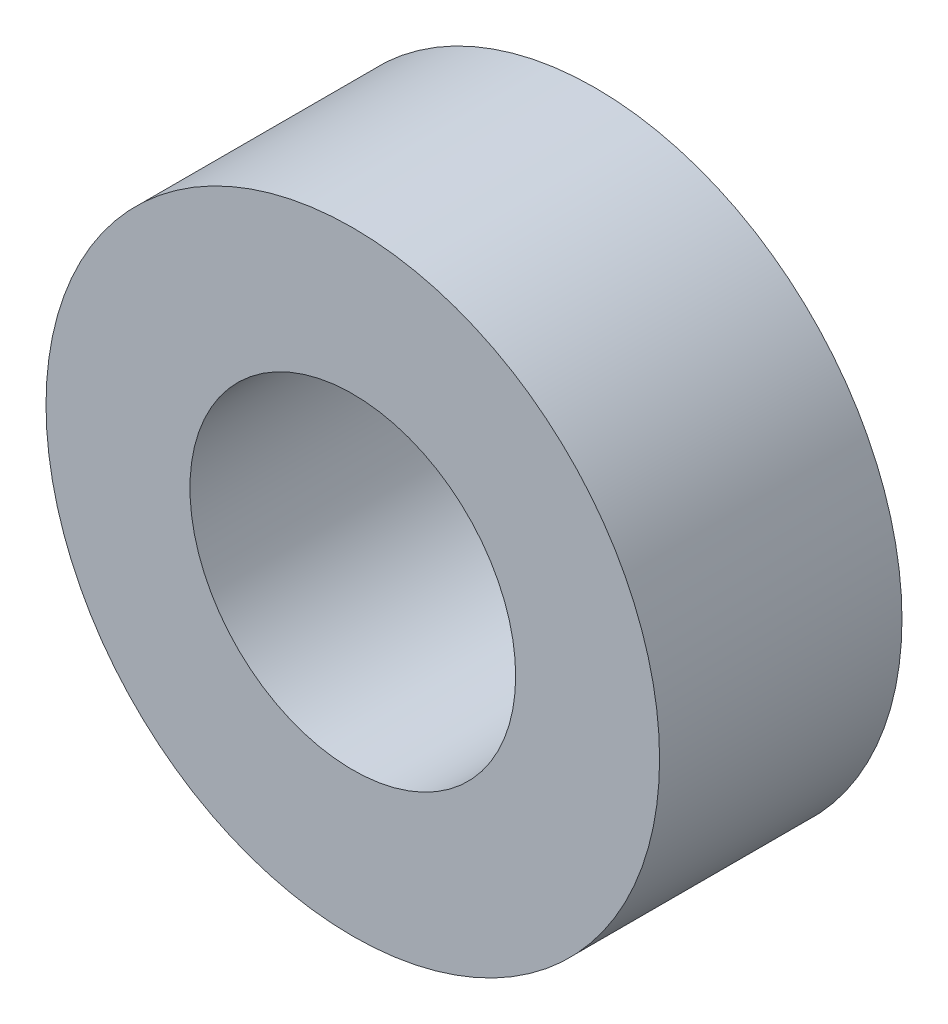
ISO-10303-21;
HEADER;
FILE_DESCRIPTION(('STEP AP214'),'2;1');
FILE_NAME('part.step','',(''),(''),'','','');
FILE_SCHEMA(('AUTOMOTIVE_DESIGN { 1 0 10303 214 1 1 1 1 }'));
ENDSEC;
DATA;
#1=APPLICATION_CONTEXT('core data for automotive mechanical design processes');
#2=APPLICATION_PROTOCOL_DEFINITION('international standard','automotive_design',2000,#1);
#3=PRODUCT_CONTEXT('',#1,'mechanical');
#4=PRODUCT('Part','Part','',(#3));
#5=PRODUCT_RELATED_PRODUCT_CATEGORY('part','',(#4));
#6=PRODUCT_DEFINITION_FORMATION('','',#4);
#7=PRODUCT_DEFINITION_CONTEXT('part definition',#1,'design');
#8=PRODUCT_DEFINITION('design','',#6,#7);
#9=PRODUCT_DEFINITION_SHAPE('','',#8);
#10=(LENGTH_UNIT() NAMED_UNIT(*) SI_UNIT(.MILLI.,.METRE.));
#11=(NAMED_UNIT(*) PLANE_ANGLE_UNIT() SI_UNIT($,.RADIAN.));
#12=(NAMED_UNIT(*) SI_UNIT($,.STERADIAN.) SOLID_ANGLE_UNIT());
#13=UNCERTAINTY_MEASURE_WITH_UNIT(LENGTH_MEASURE(1.E-05),#10,'distance_accuracy_value','');
#14=(GEOMETRIC_REPRESENTATION_CONTEXT(3) GLOBAL_UNCERTAINTY_ASSIGNED_CONTEXT((#13)) GLOBAL_UNIT_ASSIGNED_CONTEXT((#10,
#11,#12)) REPRESENTATION_CONTEXT('',''));
#15=CARTESIAN_POINT('',(0.,0.,0.));
#16=DIRECTION('',(0.,0.,1.));
#17=DIRECTION('',(1.,0.,0.));
#18=AXIS2_PLACEMENT_3D('',#15,#16,#17);
#19=CARTESIAN_POINT('',(0.,0.,3.2));
#20=DIRECTION('',(0.,0.,-1.));
#21=DIRECTION('',(-1.,0.,0.));
#22=AXIS2_PLACEMENT_3D('',#19,#20,#21);
#23=CYLINDRICAL_SURFACE('',#22,4.05);
#24=CARTESIAN_POINT('',(0.,0.,3.2));
#25=DIRECTION('',(0.,0.,1.));
#26=DIRECTION('',(1.,0.,0.));
#27=AXIS2_PLACEMENT_3D('',#24,#25,#26);
#28=CIRCLE('',#27,4.05);
#29=CARTESIAN_POINT('',(4.05,0.,3.2));
#30=VERTEX_POINT('',#29);
#31=EDGE_CURVE('E10',#30,#30,#28,.T.);
#32=ORIENTED_EDGE('',*,*,#31,.F.);
#33=EDGE_LOOP('',(#32));
#34=FACE_BOUND('',#33,.T.);
#35=CARTESIAN_POINT('',(0.,0.,0.));
#36=DIRECTION('',(0.,0.,1.));
#37=DIRECTION('',(1.,0.,0.));
#38=AXIS2_PLACEMENT_3D('',#35,#36,#37);
#39=CIRCLE('',#38,4.05);
#40=CARTESIAN_POINT('',(4.05,0.,0.));
#41=VERTEX_POINT('',#40);
#42=EDGE_CURVE('E36',#41,#41,#39,.T.);
#43=ORIENTED_EDGE('',*,*,#42,.T.);
#44=EDGE_LOOP('',(#43));
#45=FACE_BOUND('',#44,.T.);
#46=ADVANCED_FACE('F33',(#34,#45),#23,.T.);
#47=CARTESIAN_POINT('',(0.,0.,3.2));
#48=DIRECTION('',(0.,0.,1.));
#49=DIRECTION('',(1.,0.,0.));
#50=AXIS2_PLACEMENT_3D('',#47,#48,#49);
#51=PLANE('',#50);
#52=CARTESIAN_POINT('',(0.,0.,3.2));
#53=DIRECTION('',(0.,0.,1.));
#54=DIRECTION('',(1.,0.,0.));
#55=AXIS2_PLACEMENT_3D('',#52,#53,#54);
#56=CIRCLE('',#55,2.15);
#57=CARTESIAN_POINT('',(2.15,0.,3.2));
#58=VERTEX_POINT('',#57);
#59=EDGE_CURVE('E43',#58,#58,#56,.T.);
#60=ORIENTED_EDGE('',*,*,#59,.F.);
#61=EDGE_LOOP('',(#60));
#62=FACE_BOUND('',#61,.T.);
#63=ORIENTED_EDGE('',*,*,#31,.T.);
#64=EDGE_LOOP('',(#63));
#65=FACE_BOUND('',#64,.T.);
#66=ADVANCED_FACE('F54',(#62,#65),#51,.T.);
#67=CARTESIAN_POINT('',(0.,0.,0.));
#68=DIRECTION('',(0.,0.,1.));
#69=DIRECTION('',(1.,0.,0.));
#70=AXIS2_PLACEMENT_3D('',#67,#68,#69);
#71=PLANE('',#70);
#72=CARTESIAN_POINT('',(0.,0.,0.));
#73=DIRECTION('',(0.,0.,1.));
#74=DIRECTION('',(1.,0.,0.));
#75=AXIS2_PLACEMENT_3D('',#72,#73,#74);
#76=CIRCLE('',#75,2.15);
#77=CARTESIAN_POINT('',(2.15,0.,0.));
#78=VERTEX_POINT('',#77);
#79=EDGE_CURVE('E45',#78,#78,#76,.T.);
#80=ORIENTED_EDGE('',*,*,#79,.T.);
#81=EDGE_LOOP('',(#80));
#82=FACE_BOUND('',#81,.T.);
#83=ORIENTED_EDGE('',*,*,#42,.F.);
#84=EDGE_LOOP('',(#83));
#85=FACE_BOUND('',#84,.T.);
#86=ADVANCED_FACE('F56',(#82,#85),#71,.F.);
#87=CARTESIAN_POINT('',(0.,0.,3.2));
#88=DIRECTION('',(0.,0.,-1.));
#89=DIRECTION('',(-1.,0.,0.));
#90=AXIS2_PLACEMENT_3D('',#87,#88,#89);
#91=CYLINDRICAL_SURFACE('',#90,2.15);
#92=ORIENTED_EDGE('',*,*,#59,.T.);
#93=EDGE_LOOP('',(#92));
#94=FACE_BOUND('',#93,.T.);
#95=ORIENTED_EDGE('',*,*,#79,.F.);
#96=EDGE_LOOP('',(#95));
#97=FACE_BOUND('',#96,.T.);
#98=ADVANCED_FACE('F51',(#94,#97),#91,.F.);
#99=CLOSED_SHELL('',(#46,#66,#86,#98));
#100=MANIFOLD_SOLID_BREP('B2',#99);
#101=ADVANCED_BREP_SHAPE_REPRESENTATION('',(#18,#100),#14);
#102=SHAPE_DEFINITION_REPRESENTATION(#9,#101);
ENDSEC;
END-ISO-10303-21;
